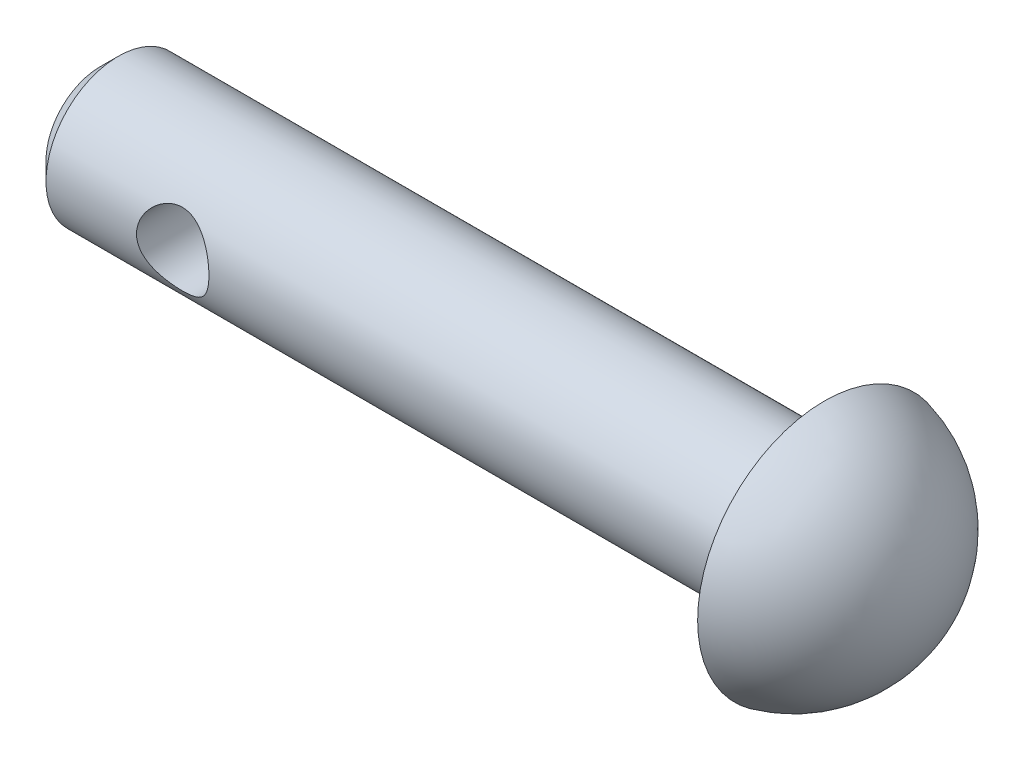
ISO-10303-21;
HEADER;
FILE_DESCRIPTION(('STEP AP214'),'2;1');
FILE_NAME('part.step','',(''),(''),'','','');
FILE_SCHEMA(('AUTOMOTIVE_DESIGN { 1 0 10303 214 1 1 1 1 }'));
ENDSEC;
DATA;
#1=APPLICATION_CONTEXT('core data for automotive mechanical design processes');
#2=APPLICATION_PROTOCOL_DEFINITION('international standard','automotive_design',2000,#1);
#3=PRODUCT_CONTEXT('',#1,'mechanical');
#4=PRODUCT('Part','Part','',(#3));
#5=PRODUCT_RELATED_PRODUCT_CATEGORY('part','',(#4));
#6=PRODUCT_DEFINITION_FORMATION('','',#4);
#7=PRODUCT_DEFINITION_CONTEXT('part definition',#1,'design');
#8=PRODUCT_DEFINITION('design','',#6,#7);
#9=PRODUCT_DEFINITION_SHAPE('','',#8);
#10=(LENGTH_UNIT() NAMED_UNIT(*) SI_UNIT(.MILLI.,.METRE.));
#11=(NAMED_UNIT(*) PLANE_ANGLE_UNIT() SI_UNIT($,.RADIAN.));
#12=(NAMED_UNIT(*) SI_UNIT($,.STERADIAN.) SOLID_ANGLE_UNIT());
#13=UNCERTAINTY_MEASURE_WITH_UNIT(LENGTH_MEASURE(1.E-05),#10,'distance_accuracy_value','');
#14=(GEOMETRIC_REPRESENTATION_CONTEXT(3) GLOBAL_UNCERTAINTY_ASSIGNED_CONTEXT((#13)) GLOBAL_UNIT_ASSIGNED_CONTEXT((#10,
#11,#12)) REPRESENTATION_CONTEXT('',''));
#15=CARTESIAN_POINT('',(0.,0.,0.));
#16=DIRECTION('',(0.,0.,1.));
#17=DIRECTION('',(1.,0.,0.));
#18=AXIS2_PLACEMENT_3D('',#15,#16,#17);
#19=CARTESIAN_POINT('',(10.,0.,0.));
#20=DIRECTION('',(-1.,0.,0.));
#21=DIRECTION('',(0.,0.,1.));
#22=AXIS2_PLACEMENT_3D('',#19,#20,#21);
#23=CYLINDRICAL_SURFACE('',#22,2.);
#24=CARTESIAN_POINT('',(-5.,0.,2.));
#25=CARTESIAN_POINT('',(-5.0000033023195,-0.0525719629529865,1.99999713404151));
#26=CARTESIAN_POINT('',(-5.00417007312168,-0.105206599698033,1.99790491019518));
#27=CARTESIAN_POINT('',(-5.02065288034092,-0.208920235268425,1.98974156037396));
#28=CARTESIAN_POINT('',(-5.03298439299765,-0.259996086713504,1.98366287828984));
#29=CARTESIAN_POINT('',(-5.06519380861679,-0.358933544880574,1.96816279403312));
#30=CARTESIAN_POINT('',(-5.08504238424801,-0.40680680293918,1.9587543917752));
#31=CARTESIAN_POINT('',(-5.13157062136494,-0.498472616806565,1.93745776515779));
#32=CARTESIAN_POINT('',(-5.15824974424885,-0.54226549399005,1.9255697363353));
#33=CARTESIAN_POINT('',(-5.2195172494853,-0.627507817761919,1.89956258258057));
#34=CARTESIAN_POINT('',(-5.25448647923964,-0.668655211122112,1.88535199127536));
#35=CARTESIAN_POINT('',(-5.33052147924703,-0.744779444866977,1.85659970246744));
#36=CARTESIAN_POINT('',(-5.37159185177244,-0.779751583106766,1.84205776209035));
#37=CARTESIAN_POINT('',(-5.46248334952338,-0.845252000450278,1.81298951197347));
#38=CARTESIAN_POINT('',(-5.51273609834591,-0.875225335551637,1.79855186970132));
#39=CARTESIAN_POINT('',(-5.61836733598621,-0.926168226890695,1.77285978772321));
#40=CARTESIAN_POINT('',(-5.67374212872275,-0.947144214966334,1.7616030760699));
#41=CARTESIAN_POINT('',(-5.78466510542192,-0.978132442188588,1.74457867037809));
#42=CARTESIAN_POINT('',(-5.84000445206739,-0.988725857080441,1.73852271583714));
#43=CARTESIAN_POINT('',(-5.95197883777948,-1.00042699330885,1.73181889948528));
#44=CARTESIAN_POINT('',(-6.00861254087116,-1.00154408837307,1.73116569343288));
#45=CARTESIAN_POINT('',(-6.11428602431537,-0.994687287172294,1.73510930257248));
#46=CARTESIAN_POINT('',(-6.16342403122305,-0.987784559536821,1.73908763662014));
#47=CARTESIAN_POINT('',(-6.25972190937304,-0.966939849056932,1.7507622873385));
#48=CARTESIAN_POINT('',(-6.30688114530532,-0.952995623897651,1.75845978831776));
#49=CARTESIAN_POINT('',(-6.39922913256566,-0.918209780386003,1.77687476412741));
#50=CARTESIAN_POINT('',(-6.44434639878579,-0.897215067115994,1.78765840663999));
#51=CARTESIAN_POINT('',(-6.53063429259001,-0.849041687668002,1.81103404281404));
#52=CARTESIAN_POINT('',(-6.57180313560009,-0.821860243812467,1.82362684780191));
#53=CARTESIAN_POINT('',(-6.65452125274323,-0.758066054912788,1.85113157903286));
#54=CARTESIAN_POINT('',(-6.69545687357616,-0.720694458369281,1.86613510236746));
#55=CARTESIAN_POINT('',(-6.7707354185909,-0.639555578741373,1.89547623300407));
#56=CARTESIAN_POINT('',(-6.80507519203388,-0.595785256574285,1.90981351958801));
#57=CARTESIAN_POINT('',(-6.86768566102973,-0.500516505831848,1.93701987282964));
#58=CARTESIAN_POINT('',(-6.89560047244574,-0.448753591599408,1.94978984162007));
#59=CARTESIAN_POINT('',(-6.94209702904301,-0.340466215488797,1.97157881121242));
#60=CARTESIAN_POINT('',(-6.96068618501517,-0.283945576265277,1.98060078943553));
#61=CARTESIAN_POINT('',(-6.98647540371668,-0.172766491660702,1.99324333741436));
#62=CARTESIAN_POINT('',(-6.99449123574678,-0.118341530548324,1.99724938301312));
#63=CARTESIAN_POINT('',(-7.00146473113449,-0.00877959994935351,2.00073013459102));
#64=CARTESIAN_POINT('',(-7.00042668563948,0.0463570198699015,2.00020698721312));
#65=CARTESIAN_POINT('',(-6.98979331158125,0.151232971985994,1.99491192253441));
#66=CARTESIAN_POINT('',(-6.98086746726997,0.201059408049954,1.9904724568819));
#67=CARTESIAN_POINT('',(-6.95576192810491,0.298406892301917,1.97822171314819));
#68=CARTESIAN_POINT('',(-6.93958143354664,0.345927685690997,1.97041006334332));
#69=CARTESIAN_POINT('',(-6.90000153356683,0.438888608449665,1.95184251413669));
#70=CARTESIAN_POINT('',(-6.87640894988319,0.484230397006154,1.94100881769939));
#71=CARTESIAN_POINT('',(-6.82289246435396,0.570461361698921,1.91743974317109));
#72=CARTESIAN_POINT('',(-6.79296586540657,0.611348629775282,1.90470355565785));
#73=CARTESIAN_POINT('',(-6.72423957466713,0.691767689290653,1.87708221337464));
#74=CARTESIAN_POINT('',(-6.68485713154644,0.730772077824638,1.86210884848441));
#75=CARTESIAN_POINT('',(-6.6000748487307,0.801856321113239,1.83262391603874));
#76=CARTESIAN_POINT('',(-6.55467088118363,0.833931385690841,1.81811267381526));
#77=CARTESIAN_POINT('',(-6.45635634579969,0.891707914497695,1.79051192226068));
#78=CARTESIAN_POINT('',(-6.40318873379141,0.917025495878637,1.77752529663472));
#79=CARTESIAN_POINT('',(-6.29248993230748,0.958082826013803,1.75574072368126));
#80=CARTESIAN_POINT('',(-6.23496447349881,0.97383491588757,1.74693738240618));
#81=CARTESIAN_POINT('',(-6.12308977713855,0.993861687449679,1.73561501008667));
#82=CARTESIAN_POINT('',(-6.06896574657096,0.999092996400865,1.73257383460491));
#83=CARTESIAN_POINT('',(-5.96055293282927,1.00068915438079,1.73165354646175));
#84=CARTESIAN_POINT('',(-5.90626423126057,0.997057846624398,1.73377219627553));
#85=CARTESIAN_POINT('',(-5.80451649846798,0.981926125592263,1.74237862050025));
#86=CARTESIAN_POINT('',(-5.7568995298556,0.971208314342799,1.74843094482394));
#87=CARTESIAN_POINT('',(-5.6641918805753,0.943175358224645,1.76371016187918));
#88=CARTESIAN_POINT('',(-5.61910201790803,0.92585809115981,1.77293807569676));
#89=CARTESIAN_POINT('',(-5.52937514901339,0.883815745300683,1.79428530364528));
#90=CARTESIAN_POINT('',(-5.4849720981703,0.858671137816458,1.80655722396191));
#91=CARTESIAN_POINT('',(-5.40072546381941,0.802150971636634,1.8323533163459));
#92=CARTESIAN_POINT('',(-5.36088426948151,0.770772171238647,1.84587813794522));
#93=CARTESIAN_POINT('',(-5.28185801764238,0.69820332666464,1.87462323159313));
#94=CARTESIAN_POINT('',(-5.24334089763808,0.65628442301017,1.88984983311469));
#95=CARTESIAN_POINT('',(-5.17373701657637,0.566154806220279,1.91877752255088));
#96=CARTESIAN_POINT('',(-5.14265426057371,0.517940723256784,1.9324777860804));
#97=CARTESIAN_POINT('',(-5.0887636372378,0.415931596819946,1.95698009585103));
#98=CARTESIAN_POINT('',(-5.06601583058857,0.362099503934614,1.96776096562909));
#99=CARTESIAN_POINT('',(-5.03019183208105,0.250742101294191,1.98501341363465));
#100=CARTESIAN_POINT('',(-5.01708815317042,0.193227799623165,1.99149723372932));
#101=CARTESIAN_POINT('',(-5.00610258892415,0.112601946483383,1.99695461909663));
#102=CARTESIAN_POINT('',(-5.00381735913638,0.0901618794394978,1.99809365339202));
#103=CARTESIAN_POINT('',(-5.00076533448319,0.045151731807157,1.99961696977865));
#104=CARTESIAN_POINT('',(-4.9999985815288,0.0225816476473811,2.00000123103763));
#105=CARTESIAN_POINT('',(-5.,0.,2.));
#106=B_SPLINE_CURVE_WITH_KNOTS('',3,(#24,#25,#26,#27,#28,#29,#30,#31,#32,#33,#34,#35,#36,#37,
#38,#39,#40,#41,#42,#43,#44,#45,#46,#47,#48,#49,#50,#51,#52,#53,#54,#55,#56,#57,#58,#59,#60,#61,
#62,#63,#64,#65,#66,#67,#68,#69,#70,#71,#72,#73,#74,#75,#76,#77,#78,#79,#80,#81,#82,#83,#84,#85,
#86,#87,#88,#89,#90,#91,#92,#93,#94,#95,#96,#97,#98,#99,#100,#101,#102,#103,#104,#105),
.UNSPECIFIED.,.T.,.F.,(4,2,2,2,2,2,2,2,2,2,2,2,2,2,2,2,2,2,2,2,2,2,2,2,2,2,2,2,2,2,2,2,2,2,2,2,
2,2,2,2,4),(0.,0.157624257420293,0.315548149709198,0.472862155492299,0.630163760581568,
0.796981758718088,0.963926237654035,1.14381726430753,1.32357947898281,1.4925801214023,
1.6614135732902,1.81005712409321,1.95874803925678,2.11090240168487,2.26312521260222,
2.43464941333878,2.60625534598686,2.78583022214441,2.96526216912279,3.12983290471346,
3.29432564511476,3.44606906506122,3.59782921630931,3.75392856027899,3.91009450748339,
4.08159610644419,4.25321588615432,4.43314682159674,4.61284511940778,4.77529307498373,
4.93767059860005,5.08457930244183,5.23153528783678,5.38836456775614,5.54527561138958,
5.72125242752498,5.89732383376573,6.07464013662925,6.2514490862493,6.31915280137698,
6.38685838514847),.UNSPECIFIED.);
#107=CARTESIAN_POINT('',(-5.,0.,2.));
#108=VERTEX_POINT('',#107);
#109=EDGE_CURVE('E45',#108,#108,#106,.T.);
#110=ORIENTED_EDGE('',*,*,#109,.T.);
#111=EDGE_LOOP('',(#110));
#112=FACE_BOUND('',#111,.T.);
#113=CARTESIAN_POINT('',(-5.,0.,-2.));
#114=CARTESIAN_POINT('',(-5.0000033023195,0.0525719629529865,-1.99999713404151));
#115=CARTESIAN_POINT('',(-5.00417007312168,0.105206599698033,-1.99790491019518));
#116=CARTESIAN_POINT('',(-5.02065288034092,0.208920235268425,-1.98974156037396));
#117=CARTESIAN_POINT('',(-5.03298439299765,0.259996086713504,-1.98366287828984));
#118=CARTESIAN_POINT('',(-5.06519380861679,0.358933544880574,-1.96816279403312));
#119=CARTESIAN_POINT('',(-5.08504238424801,0.40680680293918,-1.9587543917752));
#120=CARTESIAN_POINT('',(-5.13157062136494,0.498472616806565,-1.93745776515779));
#121=CARTESIAN_POINT('',(-5.15824974424885,0.54226549399005,-1.9255697363353));
#122=CARTESIAN_POINT('',(-5.2195172494853,0.627507817761919,-1.89956258258057));
#123=CARTESIAN_POINT('',(-5.25448647923964,0.668655211122112,-1.88535199127536));
#124=CARTESIAN_POINT('',(-5.33052147924703,0.744779444866977,-1.85659970246744));
#125=CARTESIAN_POINT('',(-5.37159185177244,0.779751583106766,-1.84205776209035));
#126=CARTESIAN_POINT('',(-5.46248334952338,0.845252000450278,-1.81298951197347));
#127=CARTESIAN_POINT('',(-5.51273609834591,0.875225335551637,-1.79855186970132));
#128=CARTESIAN_POINT('',(-5.61836733598621,0.926168226890695,-1.77285978772321));
#129=CARTESIAN_POINT('',(-5.67374212872275,0.947144214966334,-1.7616030760699));
#130=CARTESIAN_POINT('',(-5.78466510542192,0.978132442188588,-1.74457867037809));
#131=CARTESIAN_POINT('',(-5.84000445206739,0.988725857080441,-1.73852271583714));
#132=CARTESIAN_POINT('',(-5.95197883777948,1.00042699330885,-1.73181889948528));
#133=CARTESIAN_POINT('',(-6.00861254087116,1.00154408837307,-1.73116569343288));
#134=CARTESIAN_POINT('',(-6.11428602431537,0.994687287172294,-1.73510930257248));
#135=CARTESIAN_POINT('',(-6.16342403122305,0.987784559536821,-1.73908763662014));
#136=CARTESIAN_POINT('',(-6.25972190937304,0.966939849056932,-1.7507622873385));
#137=CARTESIAN_POINT('',(-6.30688114530532,0.952995623897651,-1.75845978831776));
#138=CARTESIAN_POINT('',(-6.39922913256566,0.918209780386003,-1.77687476412741));
#139=CARTESIAN_POINT('',(-6.44434639878579,0.897215067115994,-1.78765840663999));
#140=CARTESIAN_POINT('',(-6.53063429259001,0.849041687668002,-1.81103404281404));
#141=CARTESIAN_POINT('',(-6.57180313560009,0.821860243812467,-1.82362684780191));
#142=CARTESIAN_POINT('',(-6.65452125274323,0.758066054912788,-1.85113157903286));
#143=CARTESIAN_POINT('',(-6.69545687357616,0.720694458369281,-1.86613510236746));
#144=CARTESIAN_POINT('',(-6.7707354185909,0.639555578741373,-1.89547623300407));
#145=CARTESIAN_POINT('',(-6.80507519203388,0.595785256574285,-1.90981351958801));
#146=CARTESIAN_POINT('',(-6.86768566102973,0.500516505831848,-1.93701987282964));
#147=CARTESIAN_POINT('',(-6.89560047244574,0.448753591599408,-1.94978984162007));
#148=CARTESIAN_POINT('',(-6.94209702904301,0.340466215488797,-1.97157881121242));
#149=CARTESIAN_POINT('',(-6.96068618501517,0.283945576265277,-1.98060078943553));
#150=CARTESIAN_POINT('',(-6.98647540371668,0.172766491660702,-1.99324333741436));
#151=CARTESIAN_POINT('',(-6.99449123574678,0.118341530548324,-1.99724938301312));
#152=CARTESIAN_POINT('',(-7.00146473113449,0.00877959994935351,-2.00073013459102));
#153=CARTESIAN_POINT('',(-7.00042668563948,-0.0463570198699015,-2.00020698721312));
#154=CARTESIAN_POINT('',(-6.98979331158125,-0.151232971985994,-1.99491192253441));
#155=CARTESIAN_POINT('',(-6.98086746726997,-0.201059408049954,-1.9904724568819));
#156=CARTESIAN_POINT('',(-6.95576192810491,-0.298406892301917,-1.97822171314819));
#157=CARTESIAN_POINT('',(-6.93958143354664,-0.345927685690997,-1.97041006334332));
#158=CARTESIAN_POINT('',(-6.90000153356683,-0.438888608449665,-1.95184251413669));
#159=CARTESIAN_POINT('',(-6.87640894988319,-0.484230397006154,-1.94100881769939));
#160=CARTESIAN_POINT('',(-6.82289246435396,-0.570461361698921,-1.91743974317109));
#161=CARTESIAN_POINT('',(-6.79296586540657,-0.611348629775282,-1.90470355565785));
#162=CARTESIAN_POINT('',(-6.72423957466713,-0.691767689290653,-1.87708221337464));
#163=CARTESIAN_POINT('',(-6.68485713154644,-0.730772077824638,-1.86210884848441));
#164=CARTESIAN_POINT('',(-6.6000748487307,-0.801856321113239,-1.83262391603874));
#165=CARTESIAN_POINT('',(-6.55467088118363,-0.833931385690841,-1.81811267381526));
#166=CARTESIAN_POINT('',(-6.45635634579969,-0.891707914497695,-1.79051192226068));
#167=CARTESIAN_POINT('',(-6.40318873379141,-0.917025495878637,-1.77752529663472));
#168=CARTESIAN_POINT('',(-6.29248993230748,-0.958082826013803,-1.75574072368126));
#169=CARTESIAN_POINT('',(-6.23496447349881,-0.97383491588757,-1.74693738240618));
#170=CARTESIAN_POINT('',(-6.12308977713855,-0.993861687449679,-1.73561501008667));
#171=CARTESIAN_POINT('',(-6.06896574657096,-0.999092996400865,-1.73257383460491));
#172=CARTESIAN_POINT('',(-5.96055293282927,-1.00068915438079,-1.73165354646175));
#173=CARTESIAN_POINT('',(-5.90626423126057,-0.997057846624398,-1.73377219627553));
#174=CARTESIAN_POINT('',(-5.80451649846798,-0.981926125592263,-1.74237862050025));
#175=CARTESIAN_POINT('',(-5.7568995298556,-0.971208314342799,-1.74843094482394));
#176=CARTESIAN_POINT('',(-5.6641918805753,-0.943175358224645,-1.76371016187918));
#177=CARTESIAN_POINT('',(-5.61910201790803,-0.92585809115981,-1.77293807569676));
#178=CARTESIAN_POINT('',(-5.52937514901339,-0.883815745300683,-1.79428530364528));
#179=CARTESIAN_POINT('',(-5.4849720981703,-0.858671137816458,-1.80655722396191));
#180=CARTESIAN_POINT('',(-5.40072546381941,-0.802150971636634,-1.8323533163459));
#181=CARTESIAN_POINT('',(-5.36088426948151,-0.770772171238647,-1.84587813794522));
#182=CARTESIAN_POINT('',(-5.28185801764238,-0.69820332666464,-1.87462323159313));
#183=CARTESIAN_POINT('',(-5.24334089763808,-0.65628442301017,-1.88984983311469));
#184=CARTESIAN_POINT('',(-5.17373701657637,-0.566154806220279,-1.91877752255088));
#185=CARTESIAN_POINT('',(-5.14265426057371,-0.517940723256784,-1.9324777860804));
#186=CARTESIAN_POINT('',(-5.0887636372378,-0.415931596819946,-1.95698009585103));
#187=CARTESIAN_POINT('',(-5.06601583058857,-0.362099503934614,-1.96776096562909));
#188=CARTESIAN_POINT('',(-5.03019183208105,-0.250742101294191,-1.98501341363465));
#189=CARTESIAN_POINT('',(-5.01708815317042,-0.193227799623165,-1.99149723372932));
#190=CARTESIAN_POINT('',(-5.00610258892415,-0.112601946483383,-1.99695461909663));
#191=CARTESIAN_POINT('',(-5.00381735913638,-0.0901618794394978,-1.99809365339202));
#192=CARTESIAN_POINT('',(-5.00076533448319,-0.045151731807157,-1.99961696977865));
#193=CARTESIAN_POINT('',(-4.9999985815288,-0.0225816476473811,-2.00000123103763));
#194=CARTESIAN_POINT('',(-5.,0.,-2.));
#195=B_SPLINE_CURVE_WITH_KNOTS('',3,(#113,#114,#115,#116,#117,#118,#119,#120,#121,#122,#123,
#124,#125,#126,#127,#128,#129,#130,#131,#132,#133,#134,#135,#136,#137,#138,#139,#140,#141,#142,
#143,#144,#145,#146,#147,#148,#149,#150,#151,#152,#153,#154,#155,#156,#157,#158,#159,#160,#161,
#162,#163,#164,#165,#166,#167,#168,#169,#170,#171,#172,#173,#174,#175,#176,#177,#178,#179,#180,
#181,#182,#183,#184,#185,#186,#187,#188,#189,#190,#191,#192,#193,#194),.UNSPECIFIED.,.T.,.F.,(4,
2,2,2,2,2,2,2,2,2,2,2,2,2,2,2,2,2,2,2,2,2,2,2,2,2,2,2,2,2,2,2,2,2,2,2,2,2,2,2,4),(0.,
0.157624257420293,0.315548149709198,0.472862155492299,0.630163760581568,0.796981758718088,
0.963926237654035,1.14381726430753,1.32357947898281,1.4925801214023,1.6614135732902,
1.81005712409321,1.95874803925678,2.11090240168487,2.26312521260222,2.43464941333878,
2.60625534598686,2.78583022214441,2.96526216912279,3.12983290471346,3.29432564511476,
3.44606906506122,3.59782921630931,3.75392856027899,3.91009450748339,4.08159610644419,
4.25321588615432,4.43314682159674,4.61284511940778,4.77529307498373,4.93767059860005,
5.08457930244183,5.23153528783678,5.38836456775614,5.54527561138958,5.72125242752498,
5.89732383376573,6.07464013662925,6.2514490862493,6.31915280137698,6.38685838514847),.UNSPECIFIED.);
#196=CARTESIAN_POINT('',(-5.,0.,-2.));
#197=VERTEX_POINT('',#196);
#198=EDGE_CURVE('E61',#197,#197,#195,.T.);
#199=ORIENTED_EDGE('',*,*,#198,.T.);
#200=EDGE_LOOP('',(#199));
#201=FACE_BOUND('',#200,.T.);
#202=CARTESIAN_POINT('',(-9.5,0.,0.));
#203=DIRECTION('',(1.,0.,0.));
#204=DIRECTION('',(0.,0.,-1.));
#205=AXIS2_PLACEMENT_3D('',#202,#203,#204);
#206=CIRCLE('',#205,2.);
#207=CARTESIAN_POINT('',(-9.5,0.,-2.));
#208=VERTEX_POINT('',#207);
#209=EDGE_CURVE('E53',#208,#208,#206,.T.);
#210=ORIENTED_EDGE('',*,*,#209,.T.);
#211=EDGE_LOOP('',(#210));
#212=FACE_BOUND('',#211,.T.);
#213=CARTESIAN_POINT('',(10.,0.,0.));
#214=DIRECTION('',(1.,0.,0.));
#215=DIRECTION('',(0.,0.,-1.));
#216=AXIS2_PLACEMENT_3D('',#213,#214,#215);
#217=CIRCLE('',#216,2.);
#218=CARTESIAN_POINT('',(10.,0.,-2.));
#219=VERTEX_POINT('',#218);
#220=EDGE_CURVE('E58',#219,#219,#217,.T.);
#221=ORIENTED_EDGE('',*,*,#220,.F.);
#222=EDGE_LOOP('',(#221));
#223=FACE_BOUND('',#222,.T.);
#224=ADVANCED_FACE('F40',(#112,#201,#212,#223),#23,.T.);
#225=CARTESIAN_POINT('',(-10.,0.,0.));
#226=DIRECTION('',(1.,0.,0.));
#227=DIRECTION('',(0.,0.,-1.));
#228=AXIS2_PLACEMENT_3D('',#225,#226,#227);
#229=PLANE('',#228);
#230=CARTESIAN_POINT('',(-10.,0.,0.));
#231=DIRECTION('',(1.,0.,0.));
#232=DIRECTION('',(0.,0.,-1.));
#233=AXIS2_PLACEMENT_3D('',#230,#231,#232);
#234=CIRCLE('',#233,1.49999999999999);
#235=CARTESIAN_POINT('',(-10.,0.,-1.49999999999999));
#236=VERTEX_POINT('',#235);
#237=EDGE_CURVE('E10',#236,#236,#234,.F.);
#238=ORIENTED_EDGE('',*,*,#237,.T.);
#239=EDGE_LOOP('',(#238));
#240=FACE_BOUND('',#239,.T.);
#241=ADVANCED_FACE('F81',(#240),#229,.F.);
#242=CARTESIAN_POINT('',(-9.5,0.,0.));
#243=DIRECTION('',(1.,0.,0.));
#244=DIRECTION('',(0.,0.,-1.));
#245=AXIS2_PLACEMENT_3D('',#242,#243,#244);
#246=CONICAL_SURFACE('',#245,2.,0.78539816339745);
#247=ORIENTED_EDGE('',*,*,#237,.F.);
#248=EDGE_LOOP('',(#247));
#249=FACE_BOUND('',#248,.T.);
#250=ORIENTED_EDGE('',*,*,#209,.F.);
#251=EDGE_LOOP('',(#250));
#252=FACE_BOUND('',#251,.T.);
#253=ADVANCED_FACE('F43',(#249,#252),#246,.T.);
#254=CARTESIAN_POINT('',(9.15738502268237,0.,0.));
#255=DIRECTION('',(-1.,0.,0.));
#256=DIRECTION('',(0.,1.,0.));
#257=AXIS2_PLACEMENT_3D('',#254,#255,#256);
#258=SPHERICAL_SURFACE('',#257,3.6);
#259=CARTESIAN_POINT('',(10.,0.,0.));
#260=DIRECTION('',(-1.,0.,0.));
#261=DIRECTION('',(0.,0.,1.));
#262=AXIS2_PLACEMENT_3D('',#259,#260,#261);
#263=CIRCLE('',#262,3.5);
#264=CARTESIAN_POINT('',(10.,0.,3.5));
#265=VERTEX_POINT('',#264);
#266=EDGE_CURVE('E100',#265,#265,#263,.T.);
#267=ORIENTED_EDGE('',*,*,#266,.F.);
#268=EDGE_LOOP('',(#267));
#269=FACE_BOUND('',#268,.T.);
#270=ADVANCED_FACE('F77',(#269),#258,.T.);
#271=CARTESIAN_POINT('',(10.,0.,0.));
#272=DIRECTION('',(1.,0.,0.));
#273=DIRECTION('',(0.,0.,-1.));
#274=AXIS2_PLACEMENT_3D('',#271,#272,#273);
#275=PLANE('',#274);
#276=ORIENTED_EDGE('',*,*,#220,.T.);
#277=EDGE_LOOP('',(#276));
#278=FACE_BOUND('',#277,.T.);
#279=ORIENTED_EDGE('',*,*,#266,.T.);
#280=EDGE_LOOP('',(#279));
#281=FACE_BOUND('',#280,.T.);
#282=ADVANCED_FACE('F72',(#278,#281),#275,.F.);
#283=CARTESIAN_POINT('',(-6.,0.,-3.5));
#284=DIRECTION('',(0.,0.,1.));
#285=DIRECTION('',(1.,0.,0.));
#286=AXIS2_PLACEMENT_3D('',#283,#284,#285);
#287=CYLINDRICAL_SURFACE('',#286,1.);
#288=ORIENTED_EDGE('',*,*,#198,.F.);
#289=EDGE_LOOP('',(#288));
#290=FACE_BOUND('',#289,.T.);
#291=ORIENTED_EDGE('',*,*,#109,.F.);
#292=EDGE_LOOP('',(#291));
#293=FACE_BOUND('',#292,.T.);
#294=ADVANCED_FACE('F68',(#290,#293),#287,.F.);
#295=CLOSED_SHELL('',(#224,#241,#253,#270,#282,#294));
#296=MANIFOLD_SOLID_BREP('B2',#295);
#297=ADVANCED_BREP_SHAPE_REPRESENTATION('',(#18,#296),#14);
#298=SHAPE_DEFINITION_REPRESENTATION(#9,#297);
ENDSEC;
END-ISO-10303-21;
